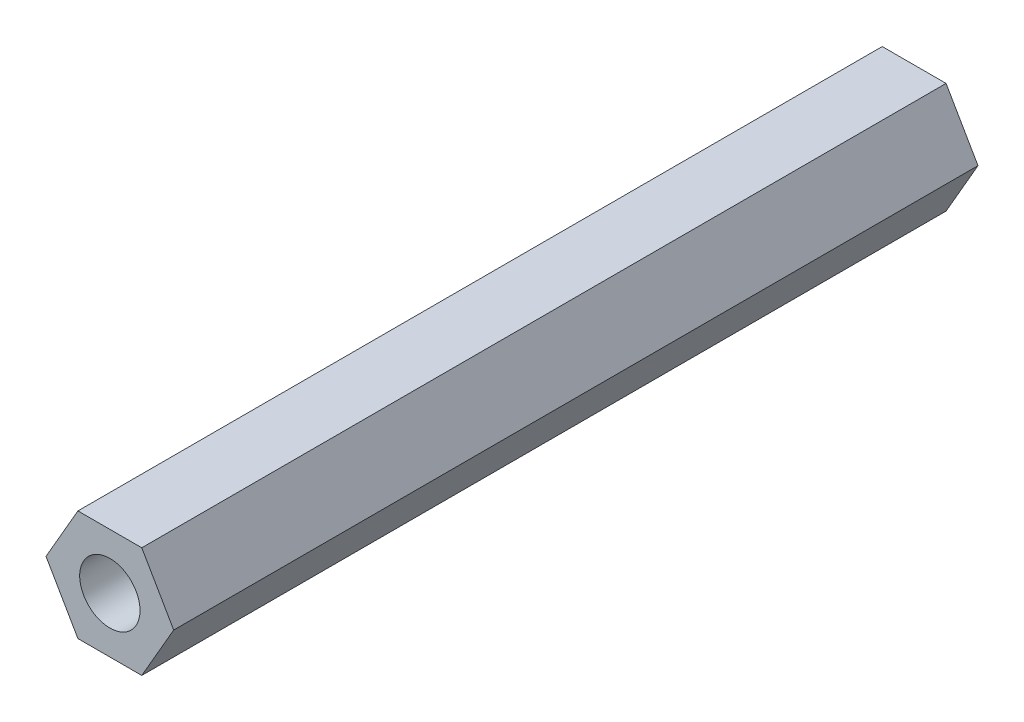
ISO-10303-21;
HEADER;
FILE_DESCRIPTION(('STEP AP214'),'2;1');
FILE_NAME('part.step','',(''),(''),'','','');
FILE_SCHEMA(('AUTOMOTIVE_DESIGN { 1 0 10303 214 1 1 1 1 }'));
ENDSEC;
DATA;
#1=APPLICATION_CONTEXT('core data for automotive mechanical design processes');
#2=APPLICATION_PROTOCOL_DEFINITION('international standard','automotive_design',2000,#1);
#3=PRODUCT_CONTEXT('',#1,'mechanical');
#4=PRODUCT('Part','Part','',(#3));
#5=PRODUCT_RELATED_PRODUCT_CATEGORY('part','',(#4));
#6=PRODUCT_DEFINITION_FORMATION('','',#4);
#7=PRODUCT_DEFINITION_CONTEXT('part definition',#1,'design');
#8=PRODUCT_DEFINITION('design','',#6,#7);
#9=PRODUCT_DEFINITION_SHAPE('','',#8);
#10=(LENGTH_UNIT() NAMED_UNIT(*) SI_UNIT(.MILLI.,.METRE.));
#11=(NAMED_UNIT(*) PLANE_ANGLE_UNIT() SI_UNIT($,.RADIAN.));
#12=(NAMED_UNIT(*) SI_UNIT($,.STERADIAN.) SOLID_ANGLE_UNIT());
#13=UNCERTAINTY_MEASURE_WITH_UNIT(LENGTH_MEASURE(1.E-05),#10,'distance_accuracy_value','');
#14=(GEOMETRIC_REPRESENTATION_CONTEXT(3) GLOBAL_UNCERTAINTY_ASSIGNED_CONTEXT((#13)) GLOBAL_UNIT_ASSIGNED_CONTEXT((#10,
#11,#12)) REPRESENTATION_CONTEXT('',''));
#15=CARTESIAN_POINT('',(0.,0.,0.));
#16=DIRECTION('',(0.,0.,1.));
#17=DIRECTION('',(1.,0.,0.));
#18=AXIS2_PLACEMENT_3D('',#15,#16,#17);
#19=CARTESIAN_POINT('',(0.,0.,40.));
#20=DIRECTION('',(0.,0.,1.));
#21=DIRECTION('',(1.,0.,0.));
#22=AXIS2_PLACEMENT_3D('',#19,#20,#21);
#23=PLANE('',#22);
#24=DIRECTION('',(0.499999999999995,0.866025403784441,0.));
#25=VECTOR('',#24,1.);
#26=CARTESIAN_POINT('',(1.5877132402715,-2.74999999999998,40.));
#27=LINE('',#26,#25);
#28=CARTESIAN_POINT('',(1.5877132402715,-2.74999999999998,40.));
#29=VERTEX_POINT('',#28);
#30=CARTESIAN_POINT('',(3.17542648054294,0.,40.));
#31=VERTEX_POINT('',#30);
#32=EDGE_CURVE('E130',#29,#31,#27,.T.);
#33=ORIENTED_EDGE('',*,*,#32,.T.);
#34=DIRECTION('',(-0.500000000000001,0.866025403784438,0.));
#35=VECTOR('',#34,1.);
#36=CARTESIAN_POINT('',(3.17542648054294,0.,40.));
#37=LINE('',#36,#35);
#38=CARTESIAN_POINT('',(1.58771324027147,2.75000000000001,40.));
#39=VERTEX_POINT('',#38);
#40=EDGE_CURVE('E88',#31,#39,#37,.T.);
#41=ORIENTED_EDGE('',*,*,#40,.T.);
#42=DIRECTION('',(-1.,0.,0.));
#43=VECTOR('',#42,1.);
#44=CARTESIAN_POINT('',(1.58771324027147,2.75000000000001,40.));
#45=LINE('',#44,#43);
#46=CARTESIAN_POINT('',(-1.58771324027148,2.74999999999999,40.));
#47=VERTEX_POINT('',#46);
#48=EDGE_CURVE('E101',#39,#47,#45,.T.);
#49=ORIENTED_EDGE('',*,*,#48,.T.);
#50=DIRECTION('',(-0.499999999999995,-0.866025403784442,0.));
#51=VECTOR('',#50,1.);
#52=CARTESIAN_POINT('',(-1.58771324027148,2.74999999999999,40.));
#53=LINE('',#52,#51);
#54=CARTESIAN_POINT('',(-3.17542648054294,0.,40.));
#55=VERTEX_POINT('',#54);
#56=EDGE_CURVE('E95',#47,#55,#53,.T.);
#57=ORIENTED_EDGE('',*,*,#56,.T.);
#58=DIRECTION('',(0.500000000000007,-0.866025403784435,0.));
#59=VECTOR('',#58,1.);
#60=CARTESIAN_POINT('',(-3.17542648054294,0.,40.));
#61=LINE('',#60,#59);
#62=CARTESIAN_POINT('',(-1.58771324027145,-2.75000000000002,40.));
#63=VERTEX_POINT('',#62);
#64=EDGE_CURVE('E99',#55,#63,#61,.T.);
#65=ORIENTED_EDGE('',*,*,#64,.T.);
#66=DIRECTION('',(1.,0.,0.));
#67=VECTOR('',#66,1.);
#68=CARTESIAN_POINT('',(-1.58771324027145,-2.75000000000002,40.));
#69=LINE('',#68,#67);
#70=EDGE_CURVE('E51',#63,#29,#69,.T.);
#71=ORIENTED_EDGE('',*,*,#70,.T.);
#72=EDGE_LOOP('',(#33,#41,#49,#57,#65,#71));
#73=FACE_BOUND('',#72,.T.);
#74=CARTESIAN_POINT('',(0.,0.,40.));
#75=DIRECTION('',(0.,0.,1.));
#76=DIRECTION('',(1.,0.,0.));
#77=AXIS2_PLACEMENT_3D('',#74,#75,#76);
#78=CIRCLE('',#77,1.5);
#79=CARTESIAN_POINT('',(1.5,0.,40.));
#80=VERTEX_POINT('',#79);
#81=EDGE_CURVE('E123',#80,#80,#78,.T.);
#82=ORIENTED_EDGE('',*,*,#81,.F.);
#83=EDGE_LOOP('',(#82));
#84=FACE_BOUND('',#83,.T.);
#85=ADVANCED_FACE('F34',(#73,#84),#23,.T.);
#86=CARTESIAN_POINT('',(0.,0.,0.));
#87=DIRECTION('',(0.,0.,1.));
#88=DIRECTION('',(1.,0.,0.));
#89=AXIS2_PLACEMENT_3D('',#86,#87,#88);
#90=PLANE('',#89);
#91=DIRECTION('',(0.499999999999995,0.866025403784441,0.));
#92=VECTOR('',#91,1.);
#93=CARTESIAN_POINT('',(1.5877132402715,-2.74999999999998,0.));
#94=LINE('',#93,#92);
#95=CARTESIAN_POINT('',(1.5877132402715,-2.74999999999998,0.));
#96=VERTEX_POINT('',#95);
#97=CARTESIAN_POINT('',(3.17542648054294,0.,0.));
#98=VERTEX_POINT('',#97);
#99=EDGE_CURVE('E119',#96,#98,#94,.T.);
#100=ORIENTED_EDGE('',*,*,#99,.F.);
#101=DIRECTION('',(1.,0.,0.));
#102=VECTOR('',#101,1.);
#103=CARTESIAN_POINT('',(-1.58771324027145,-2.75000000000002,0.));
#104=LINE('',#103,#102);
#105=CARTESIAN_POINT('',(-1.58771324027145,-2.75000000000002,0.));
#106=VERTEX_POINT('',#105);
#107=EDGE_CURVE('E80',#106,#96,#104,.T.);
#108=ORIENTED_EDGE('',*,*,#107,.F.);
#109=DIRECTION('',(0.500000000000007,-0.866025403784435,0.));
#110=VECTOR('',#109,1.);
#111=CARTESIAN_POINT('',(-3.17542648054294,0.,0.));
#112=LINE('',#111,#110);
#113=CARTESIAN_POINT('',(-3.17542648054294,0.,0.));
#114=VERTEX_POINT('',#113);
#115=EDGE_CURVE('E74',#114,#106,#112,.T.);
#116=ORIENTED_EDGE('',*,*,#115,.F.);
#117=DIRECTION('',(-0.499999999999995,-0.866025403784442,0.));
#118=VECTOR('',#117,1.);
#119=CARTESIAN_POINT('',(-1.58771324027148,2.74999999999999,0.));
#120=LINE('',#119,#118);
#121=CARTESIAN_POINT('',(-1.58771324027148,2.74999999999999,0.));
#122=VERTEX_POINT('',#121);
#123=EDGE_CURVE('E109',#122,#114,#120,.T.);
#124=ORIENTED_EDGE('',*,*,#123,.F.);
#125=DIRECTION('',(-1.,0.,0.));
#126=VECTOR('',#125,1.);
#127=CARTESIAN_POINT('',(1.58771324027147,2.75000000000001,0.));
#128=LINE('',#127,#126);
#129=CARTESIAN_POINT('',(1.58771324027147,2.75000000000001,0.));
#130=VERTEX_POINT('',#129);
#131=EDGE_CURVE('E125',#130,#122,#128,.T.);
#132=ORIENTED_EDGE('',*,*,#131,.F.);
#133=DIRECTION('',(-0.500000000000001,0.866025403784438,0.));
#134=VECTOR('',#133,1.);
#135=CARTESIAN_POINT('',(3.17542648054294,0.,0.));
#136=LINE('',#135,#134);
#137=EDGE_CURVE('E122',#98,#130,#136,.T.);
#138=ORIENTED_EDGE('',*,*,#137,.F.);
#139=EDGE_LOOP('',(#100,#108,#116,#124,#132,#138));
#140=FACE_BOUND('',#139,.T.);
#141=CARTESIAN_POINT('',(0.,0.,0.));
#142=DIRECTION('',(0.,0.,1.));
#143=DIRECTION('',(1.,0.,0.));
#144=AXIS2_PLACEMENT_3D('',#141,#142,#143);
#145=CIRCLE('',#144,1.5);
#146=CARTESIAN_POINT('',(1.5,0.,0.));
#147=VERTEX_POINT('',#146);
#148=EDGE_CURVE('E223',#147,#147,#145,.T.);
#149=ORIENTED_EDGE('',*,*,#148,.T.);
#150=EDGE_LOOP('',(#149));
#151=FACE_BOUND('',#150,.T.);
#152=ADVANCED_FACE('F139',(#140,#151),#90,.F.);
#153=CARTESIAN_POINT('',(1.5877132402715,-2.74999999999998,40.));
#154=DIRECTION('',(-0.866025403784441,0.499999999999995,0.));
#155=DIRECTION('',(-0.499999999999995,-0.866025403784441,0.));
#156=AXIS2_PLACEMENT_3D('',#153,#154,#155);
#157=PLANE('',#156);
#158=ORIENTED_EDGE('',*,*,#99,.T.);
#159=DIRECTION('',(0.,0.,-1.));
#160=VECTOR('',#159,1.);
#161=CARTESIAN_POINT('',(3.17542648054294,0.,40.));
#162=LINE('',#161,#160);
#163=EDGE_CURVE('E11',#31,#98,#162,.T.);
#164=ORIENTED_EDGE('',*,*,#163,.F.);
#165=ORIENTED_EDGE('',*,*,#32,.F.);
#166=DIRECTION('',(0.,0.,-1.));
#167=VECTOR('',#166,1.);
#168=CARTESIAN_POINT('',(1.5877132402715,-2.74999999999998,40.));
#169=LINE('',#168,#167);
#170=EDGE_CURVE('E115',#29,#96,#169,.T.);
#171=ORIENTED_EDGE('',*,*,#170,.T.);
#172=EDGE_LOOP('',(#158,#164,#165,#171));
#173=FACE_BOUND('',#172,.T.);
#174=ADVANCED_FACE('F36',(#173),#157,.F.);
#175=CARTESIAN_POINT('',(3.17542648054294,0.,40.));
#176=DIRECTION('',(-0.866025403784438,-0.500000000000001,0.));
#177=DIRECTION('',(0.500000000000001,-0.866025403784438,0.));
#178=AXIS2_PLACEMENT_3D('',#175,#176,#177);
#179=PLANE('',#178);
#180=ORIENTED_EDGE('',*,*,#137,.T.);
#181=DIRECTION('',(0.,0.,-1.));
#182=VECTOR('',#181,1.);
#183=CARTESIAN_POINT('',(1.58771324027147,2.75000000000001,40.));
#184=LINE('',#183,#182);
#185=EDGE_CURVE('E43',#39,#130,#184,.T.);
#186=ORIENTED_EDGE('',*,*,#185,.F.);
#187=ORIENTED_EDGE('',*,*,#40,.F.);
#188=ORIENTED_EDGE('',*,*,#163,.T.);
#189=EDGE_LOOP('',(#180,#186,#187,#188));
#190=FACE_BOUND('',#189,.T.);
#191=ADVANCED_FACE('F164',(#190),#179,.F.);
#192=CARTESIAN_POINT('',(1.58771324027147,2.75000000000001,40.));
#193=DIRECTION('',(0.,-1.,0.));
#194=DIRECTION('',(1.,0.,0.));
#195=AXIS2_PLACEMENT_3D('',#192,#193,#194);
#196=PLANE('',#195);
#197=ORIENTED_EDGE('',*,*,#131,.T.);
#198=DIRECTION('',(0.,0.,-1.));
#199=VECTOR('',#198,1.);
#200=CARTESIAN_POINT('',(-1.58771324027148,2.74999999999999,40.));
#201=LINE('',#200,#199);
#202=EDGE_CURVE('E110',#47,#122,#201,.T.);
#203=ORIENTED_EDGE('',*,*,#202,.F.);
#204=ORIENTED_EDGE('',*,*,#48,.F.);
#205=ORIENTED_EDGE('',*,*,#185,.T.);
#206=EDGE_LOOP('',(#197,#203,#204,#205));
#207=FACE_BOUND('',#206,.T.);
#208=ADVANCED_FACE('F136',(#207),#196,.F.);
#209=CARTESIAN_POINT('',(-1.58771324027148,2.74999999999999,40.));
#210=DIRECTION('',(0.866025403784442,-0.499999999999995,0.));
#211=DIRECTION('',(0.499999999999995,0.866025403784442,0.));
#212=AXIS2_PLACEMENT_3D('',#209,#210,#211);
#213=PLANE('',#212);
#214=ORIENTED_EDGE('',*,*,#123,.T.);
#215=DIRECTION('',(0.,0.,-1.));
#216=VECTOR('',#215,1.);
#217=CARTESIAN_POINT('',(-3.17542648054294,0.,40.));
#218=LINE('',#217,#216);
#219=EDGE_CURVE('E106',#55,#114,#218,.T.);
#220=ORIENTED_EDGE('',*,*,#219,.F.);
#221=ORIENTED_EDGE('',*,*,#56,.F.);
#222=ORIENTED_EDGE('',*,*,#202,.T.);
#223=EDGE_LOOP('',(#214,#220,#221,#222));
#224=FACE_BOUND('',#223,.T.);
#225=ADVANCED_FACE('F107',(#224),#213,.F.);
#226=CARTESIAN_POINT('',(-3.17542648054294,0.,40.));
#227=DIRECTION('',(0.866025403784435,0.500000000000007,0.));
#228=DIRECTION('',(-0.500000000000007,0.866025403784435,0.));
#229=AXIS2_PLACEMENT_3D('',#226,#227,#228);
#230=PLANE('',#229);
#231=ORIENTED_EDGE('',*,*,#115,.T.);
#232=DIRECTION('',(0.,0.,-1.));
#233=VECTOR('',#232,1.);
#234=CARTESIAN_POINT('',(-1.58771324027145,-2.75000000000002,40.));
#235=LINE('',#234,#233);
#236=EDGE_CURVE('E111',#63,#106,#235,.T.);
#237=ORIENTED_EDGE('',*,*,#236,.F.);
#238=ORIENTED_EDGE('',*,*,#64,.F.);
#239=ORIENTED_EDGE('',*,*,#219,.T.);
#240=EDGE_LOOP('',(#231,#237,#238,#239));
#241=FACE_BOUND('',#240,.T.);
#242=ADVANCED_FACE('F113',(#241),#230,.F.);
#243=CARTESIAN_POINT('',(-1.58771324027145,-2.75000000000002,40.));
#244=DIRECTION('',(0.,1.,0.));
#245=DIRECTION('',(-1.,0.,0.));
#246=AXIS2_PLACEMENT_3D('',#243,#244,#245);
#247=PLANE('',#246);
#248=ORIENTED_EDGE('',*,*,#107,.T.);
#249=ORIENTED_EDGE('',*,*,#170,.F.);
#250=ORIENTED_EDGE('',*,*,#70,.F.);
#251=ORIENTED_EDGE('',*,*,#236,.T.);
#252=EDGE_LOOP('',(#248,#249,#250,#251));
#253=FACE_BOUND('',#252,.T.);
#254=ADVANCED_FACE('F144',(#253),#247,.F.);
#255=CARTESIAN_POINT('',(0.,0.,40.));
#256=DIRECTION('',(0.,0.,-1.));
#257=DIRECTION('',(-1.,0.,0.));
#258=AXIS2_PLACEMENT_3D('',#255,#256,#257);
#259=CYLINDRICAL_SURFACE('',#258,1.5);
#260=ORIENTED_EDGE('',*,*,#81,.T.);
#261=EDGE_LOOP('',(#260));
#262=FACE_BOUND('',#261,.T.);
#263=ORIENTED_EDGE('',*,*,#148,.F.);
#264=EDGE_LOOP('',(#263));
#265=FACE_BOUND('',#264,.T.);
#266=ADVANCED_FACE('F146',(#262,#265),#259,.F.);
#267=CLOSED_SHELL('',(#85,#152,#174,#191,#208,#225,#242,#254,#266));
#268=MANIFOLD_SOLID_BREP('B2',#267);
#269=ADVANCED_BREP_SHAPE_REPRESENTATION('',(#18,#268),#14);
#270=SHAPE_DEFINITION_REPRESENTATION(#9,#269);
ENDSEC;
END-ISO-10303-21;
